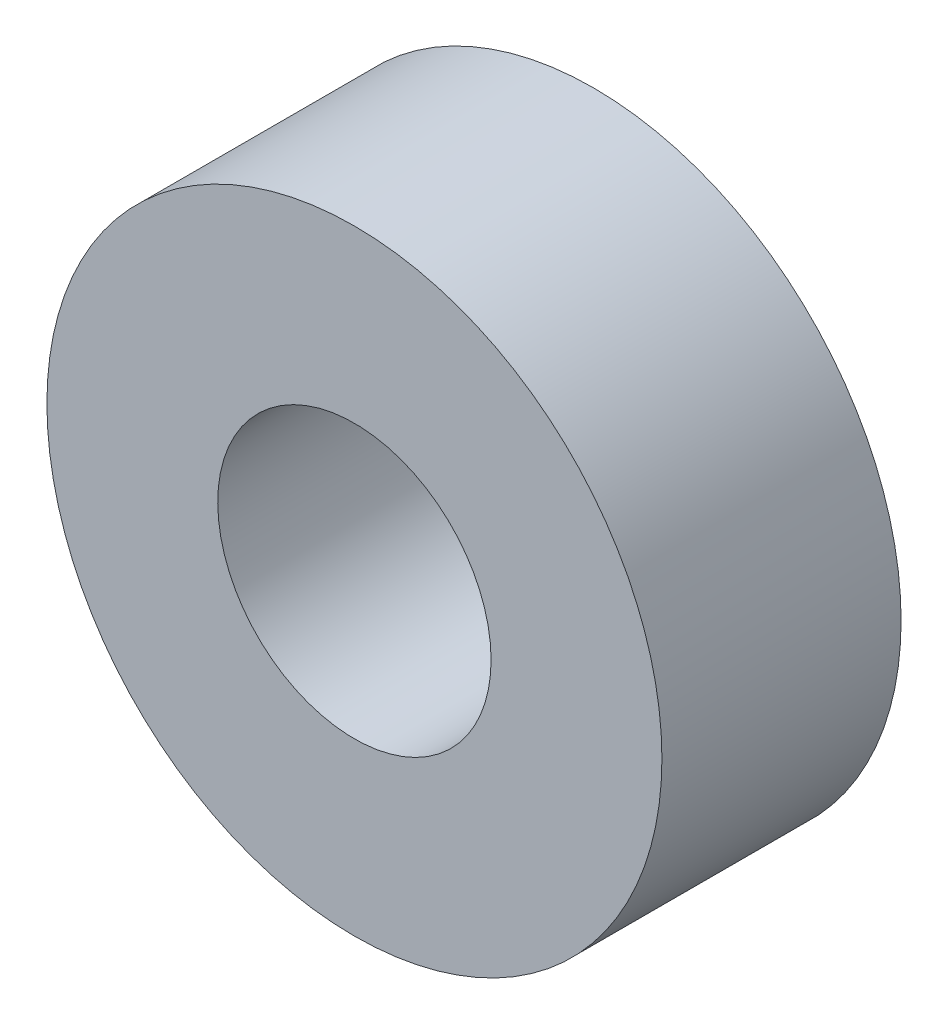
ISO-10303-21;
HEADER;
FILE_DESCRIPTION(('STEP AP214'),'2;1');
FILE_NAME('part.step','',(''),(''),'','','');
FILE_SCHEMA(('AUTOMOTIVE_DESIGN { 1 0 10303 214 1 1 1 1 }'));
ENDSEC;
DATA;
#1=APPLICATION_CONTEXT('core data for automotive mechanical design processes');
#2=APPLICATION_PROTOCOL_DEFINITION('international standard','automotive_design',2000,#1);
#3=PRODUCT_CONTEXT('',#1,'mechanical');
#4=PRODUCT('Part','Part','',(#3));
#5=PRODUCT_RELATED_PRODUCT_CATEGORY('part','',(#4));
#6=PRODUCT_DEFINITION_FORMATION('','',#4);
#7=PRODUCT_DEFINITION_CONTEXT('part definition',#1,'design');
#8=PRODUCT_DEFINITION('design','',#6,#7);
#9=PRODUCT_DEFINITION_SHAPE('','',#8);
#10=(LENGTH_UNIT() NAMED_UNIT(*) SI_UNIT(.MILLI.,.METRE.));
#11=(NAMED_UNIT(*) PLANE_ANGLE_UNIT() SI_UNIT($,.RADIAN.));
#12=(NAMED_UNIT(*) SI_UNIT($,.STERADIAN.) SOLID_ANGLE_UNIT());
#13=UNCERTAINTY_MEASURE_WITH_UNIT(LENGTH_MEASURE(1.E-05),#10,'distance_accuracy_value','');
#14=(GEOMETRIC_REPRESENTATION_CONTEXT(3) GLOBAL_UNCERTAINTY_ASSIGNED_CONTEXT((#13)) GLOBAL_UNIT_ASSIGNED_CONTEXT((#10,
#11,#12)) REPRESENTATION_CONTEXT('',''));
#15=CARTESIAN_POINT('',(0.,0.,0.));
#16=DIRECTION('',(0.,0.,1.));
#17=DIRECTION('',(1.,0.,0.));
#18=AXIS2_PLACEMENT_3D('',#15,#16,#17);
#19=CARTESIAN_POINT('',(0.,0.,32.4558441227162));
#20=DIRECTION('',(0.,0.,-1.));
#21=DIRECTION('',(-1.,0.,0.));
#22=AXIS2_PLACEMENT_3D('',#19,#20,#21);
#23=CYLINDRICAL_SURFACE('',#22,9.);
#24=CARTESIAN_POINT('',(0.,0.,0.));
#25=DIRECTION('',(0.,0.,1.));
#26=DIRECTION('',(1.,0.,0.));
#27=AXIS2_PLACEMENT_3D('',#24,#25,#26);
#28=CIRCLE('',#27,9.);
#29=CARTESIAN_POINT('',(9.,0.,0.));
#30=VERTEX_POINT('',#29);
#31=EDGE_CURVE('E34',#30,#30,#28,.T.);
#32=ORIENTED_EDGE('',*,*,#31,.T.);
#33=EDGE_LOOP('',(#32));
#34=FACE_BOUND('',#33,.T.);
#35=CARTESIAN_POINT('',(0.,0.,7.0000000000005));
#36=DIRECTION('',(0.,0.,1.));
#37=DIRECTION('',(0.,-1.,0.));
#38=AXIS2_PLACEMENT_3D('',#35,#36,#37);
#39=CIRCLE('',#38,9.);
#40=CARTESIAN_POINT('',(0.,-9.,7.00000000000051));
#41=VERTEX_POINT('',#40);
#42=EDGE_CURVE('E10',#41,#41,#39,.T.);
#43=ORIENTED_EDGE('',*,*,#42,.F.);
#44=EDGE_LOOP('',(#43));
#45=FACE_BOUND('',#44,.T.);
#46=ADVANCED_FACE('F31',(#34,#45),#23,.T.);
#47=CARTESIAN_POINT('',(0.,0.,0.));
#48=DIRECTION('',(0.,0.,1.));
#49=DIRECTION('',(1.,0.,0.));
#50=AXIS2_PLACEMENT_3D('',#47,#48,#49);
#51=PLANE('',#50);
#52=ORIENTED_EDGE('',*,*,#31,.F.);
#53=EDGE_LOOP('',(#52));
#54=FACE_BOUND('',#53,.T.);
#55=CARTESIAN_POINT('',(0.,0.,0.));
#56=DIRECTION('',(0.,0.,1.));
#57=DIRECTION('',(1.,0.,0.));
#58=AXIS2_PLACEMENT_3D('',#55,#56,#57);
#59=CIRCLE('',#58,4.);
#60=CARTESIAN_POINT('',(4.,0.,0.));
#61=VERTEX_POINT('',#60);
#62=EDGE_CURVE('E44',#61,#61,#59,.T.);
#63=ORIENTED_EDGE('',*,*,#62,.T.);
#64=EDGE_LOOP('',(#63));
#65=FACE_BOUND('',#64,.T.);
#66=ADVANCED_FACE('F53',(#54,#65),#51,.F.);
#67=CARTESIAN_POINT('',(0.,0.,32.4558441227162));
#68=DIRECTION('',(0.,0.,-1.));
#69=DIRECTION('',(-1.,0.,0.));
#70=AXIS2_PLACEMENT_3D('',#67,#68,#69);
#71=CYLINDRICAL_SURFACE('',#70,4.);
#72=ORIENTED_EDGE('',*,*,#62,.F.);
#73=EDGE_LOOP('',(#72));
#74=FACE_BOUND('',#73,.T.);
#75=CARTESIAN_POINT('',(1.8623991238087E-11,1.0547118733939E-11,7.0000000000005));
#76=DIRECTION('',(0.,0.,1.));
#77=DIRECTION('',(-0.0580168543245999,0.998315603711711,0.));
#78=AXIS2_PLACEMENT_3D('',#75,#76,#77);
#79=CIRCLE('',#78,3.99999999999999);
#80=CARTESIAN_POINT('',(-0.232067417279775,3.99326241485738,7.00000000000049));
#81=VERTEX_POINT('',#80);
#82=EDGE_CURVE('E38',#81,#81,#79,.T.);
#83=ORIENTED_EDGE('',*,*,#82,.T.);
#84=EDGE_LOOP('',(#83));
#85=FACE_BOUND('',#84,.T.);
#86=ADVANCED_FACE('F55',(#74,#85),#71,.F.);
#87=CARTESIAN_POINT('',(-17.4050562973614,299.494681113524,7.00000000000009));
#88=DIRECTION('',(0.,0.,1.));
#89=DIRECTION('',(-0.0580168543245999,0.998315603711711,0.));
#90=AXIS2_PLACEMENT_3D('',#87,#88,#89);
#91=PLANE('',#90);
#92=ORIENTED_EDGE('',*,*,#82,.F.);
#93=EDGE_LOOP('',(#92));
#94=FACE_BOUND('',#93,.T.);
#95=ORIENTED_EDGE('',*,*,#42,.T.);
#96=EDGE_LOOP('',(#95));
#97=FACE_BOUND('',#96,.T.);
#98=ADVANCED_FACE('F60',(#94,#97),#91,.T.);
#99=CLOSED_SHELL('',(#46,#66,#86,#98));
#100=MANIFOLD_SOLID_BREP('B2',#99);
#101=ADVANCED_BREP_SHAPE_REPRESENTATION('',(#18,#100),#14);
#102=SHAPE_DEFINITION_REPRESENTATION(#9,#101);
ENDSEC;
END-ISO-10303-21;
